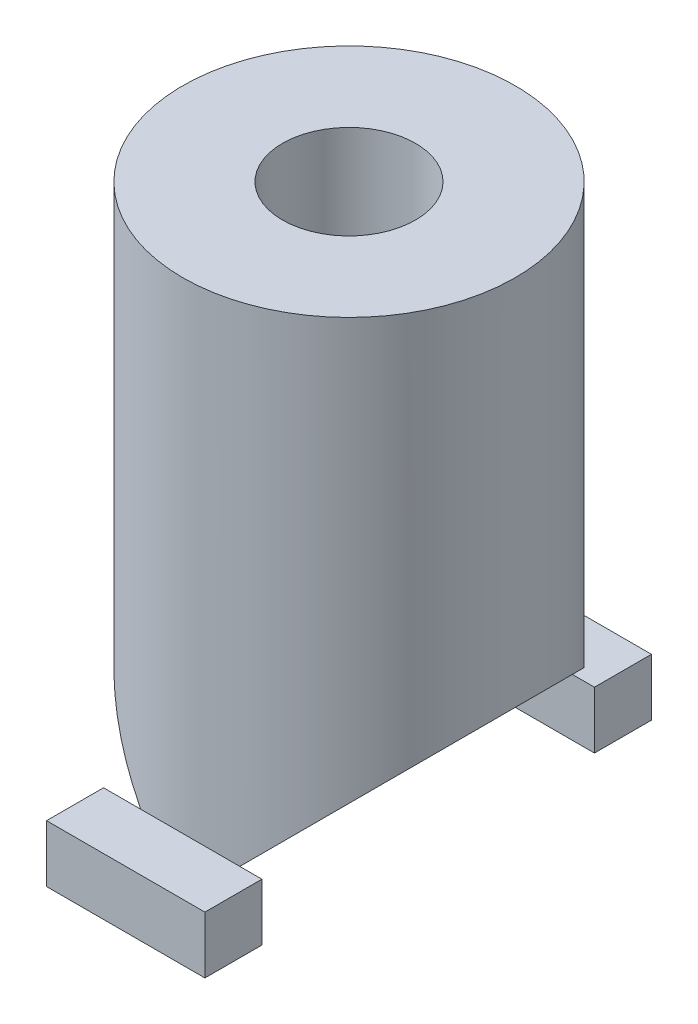
ISO-10303-21;
HEADER;
FILE_DESCRIPTION(('STEP AP214'),'2;1');
FILE_NAME('part.step','',(''),(''),'','','');
FILE_SCHEMA(('AUTOMOTIVE_DESIGN { 1 0 10303 214 1 1 1 1 }'));
ENDSEC;
DATA;
#1=APPLICATION_CONTEXT('core data for automotive mechanical design processes');
#2=APPLICATION_PROTOCOL_DEFINITION('international standard','automotive_design',2000,#1);
#3=PRODUCT_CONTEXT('',#1,'mechanical');
#4=PRODUCT('Part','Part','',(#3));
#5=PRODUCT_RELATED_PRODUCT_CATEGORY('part','',(#4));
#6=PRODUCT_DEFINITION_FORMATION('','',#4);
#7=PRODUCT_DEFINITION_CONTEXT('part definition',#1,'design');
#8=PRODUCT_DEFINITION('design','',#6,#7);
#9=PRODUCT_DEFINITION_SHAPE('','',#8);
#10=(LENGTH_UNIT() NAMED_UNIT(*) SI_UNIT(.MILLI.,.METRE.));
#11=(NAMED_UNIT(*) PLANE_ANGLE_UNIT() SI_UNIT($,.RADIAN.));
#12=(NAMED_UNIT(*) SI_UNIT($,.STERADIAN.) SOLID_ANGLE_UNIT());
#13=UNCERTAINTY_MEASURE_WITH_UNIT(LENGTH_MEASURE(1.E-05),#10,'distance_accuracy_value','');
#14=(GEOMETRIC_REPRESENTATION_CONTEXT(3) GLOBAL_UNCERTAINTY_ASSIGNED_CONTEXT((#13)) GLOBAL_UNIT_ASSIGNED_CONTEXT((#10,
#11,#12)) REPRESENTATION_CONTEXT('',''));
#15=CARTESIAN_POINT('',(0.,0.,0.));
#16=DIRECTION('',(0.,0.,1.));
#17=DIRECTION('',(1.,0.,0.));
#18=AXIS2_PLACEMENT_3D('',#15,#16,#17);
#19=CARTESIAN_POINT('',(-2.5,0.,-7.05));
#20=DIRECTION('',(0.,-1.,0.));
#21=DIRECTION('',(0.,0.,-1.));
#22=AXIS2_PLACEMENT_3D('',#19,#20,#21);
#23=PLANE('',#22);
#24=DIRECTION('',(1.,0.,0.));
#25=VECTOR('',#24,1.);
#26=CARTESIAN_POINT('',(-2.5,0.,-7.05));
#27=LINE('',#26,#25);
#28=CARTESIAN_POINT('',(-2.5,0.,-7.05));
#29=VERTEX_POINT('',#28);
#30=CARTESIAN_POINT('',(2.5,0.,-7.05));
#31=VERTEX_POINT('',#30);
#32=EDGE_CURVE('E47',#29,#31,#27,.T.);
#33=ORIENTED_EDGE('',*,*,#32,.T.);
#34=DIRECTION('',(0.,0.,-1.));
#35=VECTOR('',#34,1.);
#36=CARTESIAN_POINT('',(2.5,0.,-7.05));
#37=LINE('',#36,#35);
#38=CARTESIAN_POINT('',(2.5,0.,-5.25));
#39=VERTEX_POINT('',#38);
#40=EDGE_CURVE('E84',#39,#31,#37,.T.);
#41=ORIENTED_EDGE('',*,*,#40,.F.);
#42=DIRECTION('',(1.,0.,0.));
#43=VECTOR('',#42,1.);
#44=CARTESIAN_POINT('',(-2.5,0.,-5.25));
#45=LINE('',#44,#43);
#46=CARTESIAN_POINT('',(-2.5,0.,-5.25));
#47=VERTEX_POINT('',#46);
#48=EDGE_CURVE('E12',#47,#39,#45,.T.);
#49=ORIENTED_EDGE('',*,*,#48,.F.);
#50=DIRECTION('',(0.,0.,-1.));
#51=VECTOR('',#50,1.);
#52=CARTESIAN_POINT('',(-2.5,0.,-7.05));
#53=LINE('',#52,#51);
#54=EDGE_CURVE('E85',#47,#29,#53,.T.);
#55=ORIENTED_EDGE('',*,*,#54,.T.);
#56=EDGE_LOOP('',(#33,#41,#49,#55));
#57=FACE_BOUND('',#56,.T.);
#58=ADVANCED_FACE('F44',(#57),#23,.T.);
#59=CARTESIAN_POINT('',(-2.5,1.80209586204069,-5.25));
#60=DIRECTION('',(0.,0.,1.));
#61=DIRECTION('',(1.,0.,0.));
#62=AXIS2_PLACEMENT_3D('',#59,#60,#61);
#63=PLANE('',#62);
#64=ORIENTED_EDGE('',*,*,#48,.T.);
#65=DIRECTION('',(0.,-1.,0.));
#66=VECTOR('',#65,1.);
#67=CARTESIAN_POINT('',(2.5,1.80209586204069,-5.25));
#68=LINE('',#67,#66);
#69=CARTESIAN_POINT('',(2.5,1.80209586204069,-5.25));
#70=VERTEX_POINT('',#69);
#71=EDGE_CURVE('E101',#70,#39,#68,.T.);
#72=ORIENTED_EDGE('',*,*,#71,.F.);
#73=DIRECTION('',(1.,0.,0.));
#74=VECTOR('',#73,1.);
#75=CARTESIAN_POINT('',(-2.5,1.80209586204069,-5.25));
#76=LINE('',#75,#74);
#77=CARTESIAN_POINT('',(-2.5,1.80209586204069,-5.25));
#78=VERTEX_POINT('',#77);
#79=EDGE_CURVE('E52',#78,#70,#76,.T.);
#80=ORIENTED_EDGE('',*,*,#79,.F.);
#81=DIRECTION('',(0.,-1.,0.));
#82=VECTOR('',#81,1.);
#83=CARTESIAN_POINT('',(-2.5,1.80209586204069,-5.25));
#84=LINE('',#83,#82);
#85=EDGE_CURVE('E90',#78,#47,#84,.T.);
#86=ORIENTED_EDGE('',*,*,#85,.T.);
#87=EDGE_LOOP('',(#64,#72,#80,#86));
#88=FACE_BOUND('',#87,.T.);
#89=ADVANCED_FACE('F116',(#88),#63,.T.);
#90=CARTESIAN_POINT('',(-2.5,1.80209586204069,-5.25));
#91=DIRECTION('',(0.,1.,0.));
#92=DIRECTION('',(0.,0.,1.));
#93=AXIS2_PLACEMENT_3D('',#90,#91,#92);
#94=PLANE('',#93);
#95=ORIENTED_EDGE('',*,*,#79,.T.);
#96=DIRECTION('',(0.,0.,1.));
#97=VECTOR('',#96,1.);
#98=CARTESIAN_POINT('',(2.5,1.80209586204069,-5.25));
#99=LINE('',#98,#97);
#100=CARTESIAN_POINT('',(2.5,1.80209586204069,-7.05));
#101=VERTEX_POINT('',#100);
#102=EDGE_CURVE('E97',#101,#70,#99,.T.);
#103=ORIENTED_EDGE('',*,*,#102,.F.);
#104=DIRECTION('',(1.,0.,0.));
#105=VECTOR('',#104,1.);
#106=CARTESIAN_POINT('',(-2.5,1.80209586204069,-7.05));
#107=LINE('',#106,#105);
#108=CARTESIAN_POINT('',(-2.5,1.80209586204069,-7.05));
#109=VERTEX_POINT('',#108);
#110=EDGE_CURVE('E89',#109,#101,#107,.T.);
#111=ORIENTED_EDGE('',*,*,#110,.F.);
#112=DIRECTION('',(0.,0.,1.));
#113=VECTOR('',#112,1.);
#114=CARTESIAN_POINT('',(-2.5,1.80209586204069,-5.25));
#115=LINE('',#114,#113);
#116=EDGE_CURVE('E109',#109,#78,#115,.T.);
#117=ORIENTED_EDGE('',*,*,#116,.T.);
#118=EDGE_LOOP('',(#95,#103,#111,#117));
#119=FACE_BOUND('',#118,.T.);
#120=ADVANCED_FACE('F113',(#119),#94,.T.);
#121=CARTESIAN_POINT('',(-2.5,1.80209586204069,-7.05));
#122=DIRECTION('',(0.,0.,-1.));
#123=DIRECTION('',(-1.,0.,0.));
#124=AXIS2_PLACEMENT_3D('',#121,#122,#123);
#125=PLANE('',#124);
#126=ORIENTED_EDGE('',*,*,#110,.T.);
#127=DIRECTION('',(0.,1.,0.));
#128=VECTOR('',#127,1.);
#129=CARTESIAN_POINT('',(2.5,1.80209586204069,-7.05));
#130=LINE('',#129,#128);
#131=EDGE_CURVE('E92',#31,#101,#130,.T.);
#132=ORIENTED_EDGE('',*,*,#131,.F.);
#133=ORIENTED_EDGE('',*,*,#32,.F.);
#134=DIRECTION('',(0.,1.,0.));
#135=VECTOR('',#134,1.);
#136=CARTESIAN_POINT('',(-2.5,1.80209586204069,-7.05));
#137=LINE('',#136,#135);
#138=EDGE_CURVE('E107',#29,#109,#137,.T.);
#139=ORIENTED_EDGE('',*,*,#138,.T.);
#140=EDGE_LOOP('',(#126,#132,#133,#139));
#141=FACE_BOUND('',#140,.T.);
#142=ADVANCED_FACE('F93',(#141),#125,.T.);
#143=CARTESIAN_POINT('',(-2.5,0.,0.));
#144=DIRECTION('',(1.,0.,0.));
#145=DIRECTION('',(0.,0.,-1.));
#146=AXIS2_PLACEMENT_3D('',#143,#144,#145);
#147=PLANE('',#146);
#148=ORIENTED_EDGE('',*,*,#54,.F.);
#149=ORIENTED_EDGE('',*,*,#85,.F.);
#150=ORIENTED_EDGE('',*,*,#116,.F.);
#151=ORIENTED_EDGE('',*,*,#138,.F.);
#152=EDGE_LOOP('',(#148,#149,#150,#151));
#153=FACE_BOUND('',#152,.T.);
#154=ADVANCED_FACE('F118',(#153),#147,.F.);
#155=CARTESIAN_POINT('',(2.5,0.,0.));
#156=DIRECTION('',(1.,0.,0.));
#157=DIRECTION('',(0.,0.,-1.));
#158=AXIS2_PLACEMENT_3D('',#155,#156,#157);
#159=PLANE('',#158);
#160=ORIENTED_EDGE('',*,*,#40,.T.);
#161=ORIENTED_EDGE('',*,*,#131,.T.);
#162=ORIENTED_EDGE('',*,*,#102,.T.);
#163=ORIENTED_EDGE('',*,*,#71,.T.);
#164=EDGE_LOOP('',(#160,#161,#162,#163));
#165=FACE_BOUND('',#164,.T.);
#166=ADVANCED_FACE('F100',(#165),#159,.T.);
#167=CLOSED_SHELL('',(#58,#89,#120,#142,#154,#166));
#168=MANIFOLD_SOLID_BREP('B2',#167);
#169=CARTESIAN_POINT('',(-2.5,1.80209586204069,7.05));
#170=DIRECTION('',(0.,0.,1.));
#171=DIRECTION('',(1.,0.,0.));
#172=AXIS2_PLACEMENT_3D('',#169,#170,#171);
#173=PLANE('',#172);
#174=DIRECTION('',(1.,0.,0.));
#175=VECTOR('',#174,1.);
#176=CARTESIAN_POINT('',(-2.5,0.,7.05));
#177=LINE('',#176,#175);
#178=CARTESIAN_POINT('',(-2.5,0.,7.05));
#179=VERTEX_POINT('',#178);
#180=CARTESIAN_POINT('',(2.5,0.,7.05));
#181=VERTEX_POINT('',#180);
#182=EDGE_CURVE('E180',#179,#181,#177,.T.);
#183=ORIENTED_EDGE('',*,*,#182,.T.);
#184=DIRECTION('',(0.,-1.,0.));
#185=VECTOR('',#184,1.);
#186=CARTESIAN_POINT('',(2.5,1.80209586204069,7.05));
#187=LINE('',#186,#185);
#188=CARTESIAN_POINT('',(2.5,1.80209586204069,7.05));
#189=VERTEX_POINT('',#188);
#190=EDGE_CURVE('E217',#189,#181,#187,.T.);
#191=ORIENTED_EDGE('',*,*,#190,.F.);
#192=DIRECTION('',(1.,0.,0.));
#193=VECTOR('',#192,1.);
#194=CARTESIAN_POINT('',(-2.5,1.80209586204069,7.05));
#195=LINE('',#194,#193);
#196=CARTESIAN_POINT('',(-2.5,1.80209586204069,7.05));
#197=VERTEX_POINT('',#196);
#198=EDGE_CURVE('E42',#197,#189,#195,.T.);
#199=ORIENTED_EDGE('',*,*,#198,.F.);
#200=DIRECTION('',(0.,-1.,0.));
#201=VECTOR('',#200,1.);
#202=CARTESIAN_POINT('',(-2.5,1.80209586204069,7.05));
#203=LINE('',#202,#201);
#204=EDGE_CURVE('E218',#197,#179,#203,.T.);
#205=ORIENTED_EDGE('',*,*,#204,.T.);
#206=EDGE_LOOP('',(#183,#191,#199,#205));
#207=FACE_BOUND('',#206,.T.);
#208=ADVANCED_FACE('F177',(#207),#173,.T.);
#209=CARTESIAN_POINT('',(-2.5,1.80209586204069,5.25));
#210=DIRECTION('',(0.,1.,0.));
#211=DIRECTION('',(0.,0.,1.));
#212=AXIS2_PLACEMENT_3D('',#209,#210,#211);
#213=PLANE('',#212);
#214=ORIENTED_EDGE('',*,*,#198,.T.);
#215=DIRECTION('',(0.,0.,1.));
#216=VECTOR('',#215,1.);
#217=CARTESIAN_POINT('',(2.5,1.80209586204069,5.25));
#218=LINE('',#217,#216);
#219=CARTESIAN_POINT('',(2.5,1.80209586204069,5.25));
#220=VERTEX_POINT('',#219);
#221=EDGE_CURVE('E234',#220,#189,#218,.T.);
#222=ORIENTED_EDGE('',*,*,#221,.F.);
#223=DIRECTION('',(1.,0.,0.));
#224=VECTOR('',#223,1.);
#225=CARTESIAN_POINT('',(-2.5,1.80209586204069,5.25));
#226=LINE('',#225,#224);
#227=CARTESIAN_POINT('',(-2.5,1.80209586204069,5.25));
#228=VERTEX_POINT('',#227);
#229=EDGE_CURVE('E185',#228,#220,#226,.T.);
#230=ORIENTED_EDGE('',*,*,#229,.F.);
#231=DIRECTION('',(0.,0.,1.));
#232=VECTOR('',#231,1.);
#233=CARTESIAN_POINT('',(-2.5,1.80209586204069,5.25));
#234=LINE('',#233,#232);
#235=EDGE_CURVE('E223',#228,#197,#234,.T.);
#236=ORIENTED_EDGE('',*,*,#235,.T.);
#237=EDGE_LOOP('',(#214,#222,#230,#236));
#238=FACE_BOUND('',#237,.T.);
#239=ADVANCED_FACE('F249',(#238),#213,.T.);
#240=CARTESIAN_POINT('',(-2.5,1.80209586204069,5.25));
#241=DIRECTION('',(0.,0.,-1.));
#242=DIRECTION('',(-1.,0.,0.));
#243=AXIS2_PLACEMENT_3D('',#240,#241,#242);
#244=PLANE('',#243);
#245=ORIENTED_EDGE('',*,*,#229,.T.);
#246=DIRECTION('',(0.,1.,0.));
#247=VECTOR('',#246,1.);
#248=CARTESIAN_POINT('',(2.5,1.80209586204069,5.25));
#249=LINE('',#248,#247);
#250=CARTESIAN_POINT('',(2.5,0.,5.25));
#251=VERTEX_POINT('',#250);
#252=EDGE_CURVE('E230',#251,#220,#249,.T.);
#253=ORIENTED_EDGE('',*,*,#252,.F.);
#254=DIRECTION('',(1.,0.,0.));
#255=VECTOR('',#254,1.);
#256=CARTESIAN_POINT('',(-2.5,0.,5.25));
#257=LINE('',#256,#255);
#258=CARTESIAN_POINT('',(-2.5,0.,5.25));
#259=VERTEX_POINT('',#258);
#260=EDGE_CURVE('E222',#259,#251,#257,.T.);
#261=ORIENTED_EDGE('',*,*,#260,.F.);
#262=DIRECTION('',(0.,1.,0.));
#263=VECTOR('',#262,1.);
#264=CARTESIAN_POINT('',(-2.5,1.80209586204069,5.25));
#265=LINE('',#264,#263);
#266=EDGE_CURVE('E242',#259,#228,#265,.T.);
#267=ORIENTED_EDGE('',*,*,#266,.T.);
#268=EDGE_LOOP('',(#245,#253,#261,#267));
#269=FACE_BOUND('',#268,.T.);
#270=ADVANCED_FACE('F246',(#269),#244,.T.);
#271=CARTESIAN_POINT('',(-2.5,0.,7.05));
#272=DIRECTION('',(0.,-1.,0.));
#273=DIRECTION('',(0.,0.,-1.));
#274=AXIS2_PLACEMENT_3D('',#271,#272,#273);
#275=PLANE('',#274);
#276=ORIENTED_EDGE('',*,*,#260,.T.);
#277=DIRECTION('',(0.,0.,-1.));
#278=VECTOR('',#277,1.);
#279=CARTESIAN_POINT('',(2.5,0.,7.05));
#280=LINE('',#279,#278);
#281=EDGE_CURVE('E225',#181,#251,#280,.T.);
#282=ORIENTED_EDGE('',*,*,#281,.F.);
#283=ORIENTED_EDGE('',*,*,#182,.F.);
#284=DIRECTION('',(0.,0.,-1.));
#285=VECTOR('',#284,1.);
#286=CARTESIAN_POINT('',(-2.5,0.,7.05));
#287=LINE('',#286,#285);
#288=EDGE_CURVE('E240',#179,#259,#287,.T.);
#289=ORIENTED_EDGE('',*,*,#288,.T.);
#290=EDGE_LOOP('',(#276,#282,#283,#289));
#291=FACE_BOUND('',#290,.T.);
#292=ADVANCED_FACE('F226',(#291),#275,.T.);
#293=CARTESIAN_POINT('',(-2.5,0.,0.));
#294=DIRECTION('',(1.,0.,0.));
#295=DIRECTION('',(0.,0.,-1.));
#296=AXIS2_PLACEMENT_3D('',#293,#294,#295);
#297=PLANE('',#296);
#298=ORIENTED_EDGE('',*,*,#204,.F.);
#299=ORIENTED_EDGE('',*,*,#235,.F.);
#300=ORIENTED_EDGE('',*,*,#266,.F.);
#301=ORIENTED_EDGE('',*,*,#288,.F.);
#302=EDGE_LOOP('',(#298,#299,#300,#301));
#303=FACE_BOUND('',#302,.T.);
#304=ADVANCED_FACE('F251',(#303),#297,.F.);
#305=CARTESIAN_POINT('',(2.5,0.,0.));
#306=DIRECTION('',(1.,0.,0.));
#307=DIRECTION('',(0.,0.,-1.));
#308=AXIS2_PLACEMENT_3D('',#305,#306,#307);
#309=PLANE('',#308);
#310=ORIENTED_EDGE('',*,*,#190,.T.);
#311=ORIENTED_EDGE('',*,*,#281,.T.);
#312=ORIENTED_EDGE('',*,*,#252,.T.);
#313=ORIENTED_EDGE('',*,*,#221,.T.);
#314=EDGE_LOOP('',(#310,#311,#312,#313));
#315=FACE_BOUND('',#314,.T.);
#316=ADVANCED_FACE('F233',(#315),#309,.T.);
#317=CLOSED_SHELL('',(#208,#239,#270,#292,#304,#316));
#318=MANIFOLD_SOLID_BREP('B6',#317);
#319=CARTESIAN_POINT('',(0.,17.,0.));
#320=DIRECTION('',(0.,-1.,0.));
#321=DIRECTION('',(0.,0.,-1.));
#322=AXIS2_PLACEMENT_3D('',#319,#320,#321);
#323=CYLINDRICAL_SURFACE('',#322,5.25);
#324=CARTESIAN_POINT('',(0.,0.,0.));
#325=DIRECTION('',(0.707106781186547,-0.707106781186547,0.));
#326=DIRECTION('',(-0.707106781186547,-0.707106781186547,0.));
#327=AXIS2_PLACEMENT_3D('',#324,#325,#326);
#328=ELLIPSE('',#327,7.42462120245875,5.25);
#329=CARTESIAN_POINT('',(0.,0.,-5.25));
#330=VERTEX_POINT('',#329);
#331=CARTESIAN_POINT('',(0.,0.,5.25));
#332=VERTEX_POINT('',#331);
#333=EDGE_CURVE('E316',#330,#332,#328,.T.);
#334=ORIENTED_EDGE('',*,*,#333,.F.);
#335=CARTESIAN_POINT('',(0.,0.,0.));
#336=DIRECTION('',(-0.707106781186547,-0.707106781186547,0.));
#337=DIRECTION('',(0.707106781186547,-0.707106781186547,0.));
#338=AXIS2_PLACEMENT_3D('',#335,#336,#337);
#339=ELLIPSE('',#338,7.42462120245875,5.25);
#340=EDGE_CURVE('E314',#332,#330,#339,.T.);
#341=ORIENTED_EDGE('',*,*,#340,.F.);
#342=EDGE_LOOP('',(#334,#341));
#343=FACE_BOUND('',#342,.T.);
#344=CARTESIAN_POINT('',(0.,17.,0.));
#345=DIRECTION('',(0.,1.,0.));
#346=DIRECTION('',(0.,0.,1.));
#347=AXIS2_PLACEMENT_3D('',#344,#345,#346);
#348=CIRCLE('',#347,5.25);
#349=CARTESIAN_POINT('',(0.,17.,5.25));
#350=VERTEX_POINT('',#349);
#351=EDGE_CURVE('E175',#350,#350,#348,.T.);
#352=ORIENTED_EDGE('',*,*,#351,.F.);
#353=EDGE_LOOP('',(#352));
#354=FACE_BOUND('',#353,.T.);
#355=ADVANCED_FACE('F301',(#343,#354),#323,.T.);
#356=CARTESIAN_POINT('',(0.,17.,0.));
#357=DIRECTION('',(0.,1.,0.));
#358=DIRECTION('',(0.,0.,1.));
#359=AXIS2_PLACEMENT_3D('',#356,#357,#358);
#360=PLANE('',#359);
#361=CARTESIAN_POINT('',(0.,17.,0.));
#362=DIRECTION('',(0.,1.,0.));
#363=DIRECTION('',(0.,0.,1.));
#364=AXIS2_PLACEMENT_3D('',#361,#362,#363);
#365=CIRCLE('',#364,2.1);
#366=CARTESIAN_POINT('',(0.,17.,2.1));
#367=VERTEX_POINT('',#366);
#368=EDGE_CURVE('E321',#367,#367,#365,.T.);
#369=ORIENTED_EDGE('',*,*,#368,.F.);
#370=EDGE_LOOP('',(#369));
#371=FACE_BOUND('',#370,.T.);
#372=ORIENTED_EDGE('',*,*,#351,.T.);
#373=EDGE_LOOP('',(#372));
#374=FACE_BOUND('',#373,.T.);
#375=ADVANCED_FACE('F333',(#371,#374),#360,.T.);
#376=CARTESIAN_POINT('',(0.,10.,0.));
#377=DIRECTION('',(0.,1.,0.));
#378=DIRECTION('',(0.,0.,1.));
#379=AXIS2_PLACEMENT_3D('',#376,#377,#378);
#380=CYLINDRICAL_SURFACE('',#379,2.1);
#381=CARTESIAN_POINT('',(0.,10.,0.));
#382=DIRECTION('',(0.,1.,0.));
#383=DIRECTION('',(0.,0.,1.));
#384=AXIS2_PLACEMENT_3D('',#381,#382,#383);
#385=CIRCLE('',#384,2.1);
#386=CARTESIAN_POINT('',(0.,10.,2.1));
#387=VERTEX_POINT('',#386);
#388=EDGE_CURVE('E308',#387,#387,#385,.T.);
#389=ORIENTED_EDGE('',*,*,#388,.F.);
#390=EDGE_LOOP('',(#389));
#391=FACE_BOUND('',#390,.T.);
#392=ORIENTED_EDGE('',*,*,#368,.T.);
#393=EDGE_LOOP('',(#392));
#394=FACE_BOUND('',#393,.T.);
#395=ADVANCED_FACE('F330',(#391,#394),#380,.F.);
#396=CARTESIAN_POINT('',(0.,10.,0.));
#397=DIRECTION('',(0.,1.,0.));
#398=DIRECTION('',(0.,0.,1.));
#399=AXIS2_PLACEMENT_3D('',#396,#397,#398);
#400=PLANE('',#399);
#401=ORIENTED_EDGE('',*,*,#388,.T.);
#402=EDGE_LOOP('',(#401));
#403=FACE_BOUND('',#402,.T.);
#404=ADVANCED_FACE('F328',(#403),#400,.T.);
#405=CARTESIAN_POINT('',(7.,0.,0.));
#406=DIRECTION('',(-1.,0.,0.));
#407=DIRECTION('',(0.,0.,1.));
#408=AXIS2_PLACEMENT_3D('',#405,#406,#407);
#409=CYLINDRICAL_SURFACE('',#408,5.25);
#410=ORIENTED_EDGE('',*,*,#340,.T.);
#411=ORIENTED_EDGE('',*,*,#333,.T.);
#412=EDGE_LOOP('',(#410,#411));
#413=FACE_BOUND('',#412,.T.);
#414=ADVANCED_FACE('F317',(#413),#409,.F.);
#415=CLOSED_SHELL('',(#355,#375,#395,#404,#414));
#416=MANIFOLD_SOLID_BREP('B36',#415);
#417=ADVANCED_BREP_SHAPE_REPRESENTATION('',(#18,#168,#318,#416),#14);
#418=SHAPE_DEFINITION_REPRESENTATION(#9,#417);
ENDSEC;
END-ISO-10303-21;
